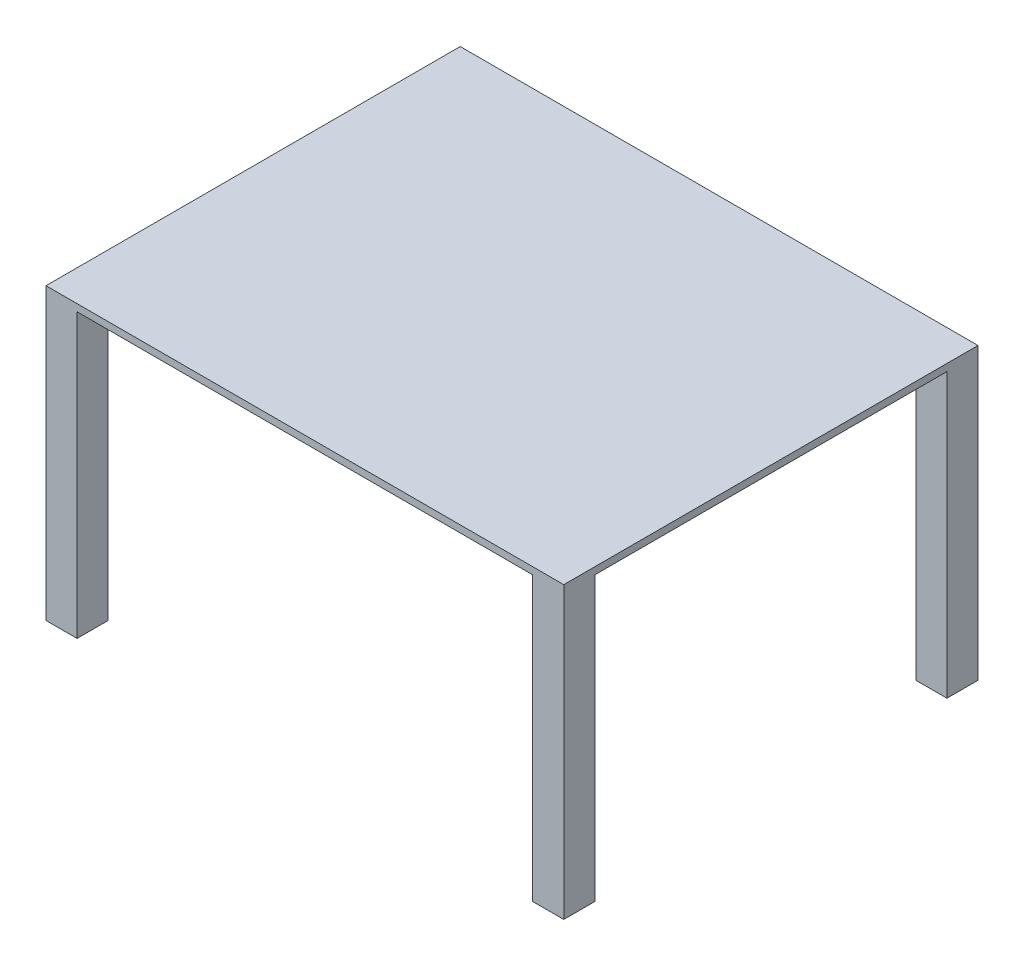
ISO-10303-21;
HEADER;
FILE_DESCRIPTION(('STEP AP214'),'2;1');
FILE_NAME('part.step','',(''),(''),'','','');
FILE_SCHEMA(('AUTOMOTIVE_DESIGN { 1 0 10303 214 1 1 1 1 }'));
ENDSEC;
DATA;
#1=APPLICATION_CONTEXT('core data for automotive mechanical design processes');
#2=APPLICATION_PROTOCOL_DEFINITION('international standard','automotive_design',2000,#1);
#3=PRODUCT_CONTEXT('',#1,'mechanical');
#4=PRODUCT('Part','Part','',(#3));
#5=PRODUCT_RELATED_PRODUCT_CATEGORY('part','',(#4));
#6=PRODUCT_DEFINITION_FORMATION('','',#4);
#7=PRODUCT_DEFINITION_CONTEXT('part definition',#1,'design');
#8=PRODUCT_DEFINITION('design','',#6,#7);
#9=PRODUCT_DEFINITION_SHAPE('','',#8);
#10=(LENGTH_UNIT() NAMED_UNIT(*) SI_UNIT(.MILLI.,.METRE.));
#11=(NAMED_UNIT(*) PLANE_ANGLE_UNIT() SI_UNIT($,.RADIAN.));
#12=(NAMED_UNIT(*) SI_UNIT($,.STERADIAN.) SOLID_ANGLE_UNIT());
#13=UNCERTAINTY_MEASURE_WITH_UNIT(LENGTH_MEASURE(1.E-05),#10,'distance_accuracy_value','');
#14=(GEOMETRIC_REPRESENTATION_CONTEXT(3) GLOBAL_UNCERTAINTY_ASSIGNED_CONTEXT((#13)) GLOBAL_UNIT_ASSIGNED_CONTEXT((#10,
#11,#12)) REPRESENTATION_CONTEXT('',''));
#15=CARTESIAN_POINT('',(0.,0.,0.));
#16=DIRECTION('',(0.,0.,1.));
#17=DIRECTION('',(1.,0.,0.));
#18=AXIS2_PLACEMENT_3D('',#15,#16,#17);
#19=CARTESIAN_POINT('',(-625.,17.,500.));
#20=DIRECTION('',(1.,0.,0.));
#21=DIRECTION('',(0.,0.,-1.));
#22=AXIS2_PLACEMENT_3D('',#19,#20,#21);
#23=PLANE('',#22);
#24=DIRECTION('',(0.,-1.,0.));
#25=VECTOR('',#24,1.);
#26=CARTESIAN_POINT('',(-625.,17.,500.));
#27=LINE('',#26,#25);
#28=CARTESIAN_POINT('',(-625.,17.,500.));
#29=VERTEX_POINT('',#28);
#30=CARTESIAN_POINT('',(-625.,-683.,500.));
#31=VERTEX_POINT('',#30);
#32=EDGE_CURVE('E260',#29,#31,#27,.T.);
#33=ORIENTED_EDGE('',*,*,#32,.F.);
#34=DIRECTION('',(0.,0.,1.));
#35=VECTOR('',#34,1.);
#36=CARTESIAN_POINT('',(-625.,17.,500.));
#37=LINE('',#36,#35);
#38=CARTESIAN_POINT('',(-625.,17.,-500.));
#39=VERTEX_POINT('',#38);
#40=EDGE_CURVE('E243',#39,#29,#37,.T.);
#41=ORIENTED_EDGE('',*,*,#40,.F.);
#42=DIRECTION('',(0.,-1.,0.));
#43=VECTOR('',#42,1.);
#44=CARTESIAN_POINT('',(-625.,17.,-500.));
#45=LINE('',#44,#43);
#46=CARTESIAN_POINT('',(-625.,-683.,-500.));
#47=VERTEX_POINT('',#46);
#48=EDGE_CURVE('E160',#39,#47,#45,.T.);
#49=ORIENTED_EDGE('',*,*,#48,.T.);
#50=DIRECTION('',(0.,0.,1.));
#51=VECTOR('',#50,1.);
#52=CARTESIAN_POINT('',(-625.,-683.,-500.));
#53=LINE('',#52,#51);
#54=CARTESIAN_POINT('',(-625.,-683.,-425.));
#55=VERTEX_POINT('',#54);
#56=EDGE_CURVE('E199',#47,#55,#53,.T.);
#57=ORIENTED_EDGE('',*,*,#56,.T.);
#58=DIRECTION('',(0.,1.,0.));
#59=VECTOR('',#58,1.);
#60=CARTESIAN_POINT('',(-625.,-683.,-425.));
#61=LINE('',#60,#59);
#62=CARTESIAN_POINT('',(-625.,0.,-425.));
#63=VERTEX_POINT('',#62);
#64=EDGE_CURVE('E214',#55,#63,#61,.T.);
#65=ORIENTED_EDGE('',*,*,#64,.T.);
#66=DIRECTION('',(0.,0.,1.));
#67=VECTOR('',#66,1.);
#68=CARTESIAN_POINT('',(-625.,0.,500.));
#69=LINE('',#68,#67);
#70=CARTESIAN_POINT('',(-625.,0.,425.));
#71=VERTEX_POINT('',#70);
#72=EDGE_CURVE('E238',#63,#71,#69,.T.);
#73=ORIENTED_EDGE('',*,*,#72,.T.);
#74=DIRECTION('',(0.,1.,0.));
#75=VECTOR('',#74,1.);
#76=CARTESIAN_POINT('',(-625.,-683.,425.));
#77=LINE('',#76,#75);
#78=CARTESIAN_POINT('',(-625.,-683.,425.));
#79=VERTEX_POINT('',#78);
#80=EDGE_CURVE('E235',#79,#71,#77,.T.);
#81=ORIENTED_EDGE('',*,*,#80,.F.);
#82=DIRECTION('',(0.,0.,1.));
#83=VECTOR('',#82,1.);
#84=CARTESIAN_POINT('',(-625.,-683.,500.));
#85=LINE('',#84,#83);
#86=EDGE_CURVE('E218',#79,#31,#85,.T.);
#87=ORIENTED_EDGE('',*,*,#86,.T.);
#88=EDGE_LOOP('',(#33,#41,#49,#57,#65,#73,#81,#87));
#89=FACE_BOUND('',#88,.T.);
#90=ADVANCED_FACE('F39',(#89),#23,.F.);
#91=CARTESIAN_POINT('',(625.,17.,500.));
#92=DIRECTION('',(0.,0.,-1.));
#93=DIRECTION('',(-1.,0.,0.));
#94=AXIS2_PLACEMENT_3D('',#91,#92,#93);
#95=PLANE('',#94);
#96=DIRECTION('',(1.,0.,0.));
#97=VECTOR('',#96,1.);
#98=CARTESIAN_POINT('',(625.,0.,500.));
#99=LINE('',#98,#97);
#100=CARTESIAN_POINT('',(-550.,0.,500.));
#101=VERTEX_POINT('',#100);
#102=CARTESIAN_POINT('',(550.,0.,500.));
#103=VERTEX_POINT('',#102);
#104=EDGE_CURVE('E252',#101,#103,#99,.T.);
#105=ORIENTED_EDGE('',*,*,#104,.T.);
#106=DIRECTION('',(0.,1.,0.));
#107=VECTOR('',#106,1.);
#108=CARTESIAN_POINT('',(550.,-683.,500.));
#109=LINE('',#108,#107);
#110=CARTESIAN_POINT('',(550.,-683.,500.));
#111=VERTEX_POINT('',#110);
#112=EDGE_CURVE('E197',#111,#103,#109,.T.);
#113=ORIENTED_EDGE('',*,*,#112,.F.);
#114=DIRECTION('',(1.,0.,0.));
#115=VECTOR('',#114,1.);
#116=CARTESIAN_POINT('',(625.,-683.,500.));
#117=LINE('',#116,#115);
#118=CARTESIAN_POINT('',(625.,-683.,500.));
#119=VERTEX_POINT('',#118);
#120=EDGE_CURVE('E193',#111,#119,#117,.T.);
#121=ORIENTED_EDGE('',*,*,#120,.T.);
#122=DIRECTION('',(0.,-1.,0.));
#123=VECTOR('',#122,1.);
#124=CARTESIAN_POINT('',(625.,17.,500.));
#125=LINE('',#124,#123);
#126=CARTESIAN_POINT('',(625.,17.,500.));
#127=VERTEX_POINT('',#126);
#128=EDGE_CURVE('E159',#127,#119,#125,.T.);
#129=ORIENTED_EDGE('',*,*,#128,.F.);
#130=DIRECTION('',(1.,0.,0.));
#131=VECTOR('',#130,1.);
#132=CARTESIAN_POINT('',(625.,17.,500.));
#133=LINE('',#132,#131);
#134=EDGE_CURVE('E245',#29,#127,#133,.T.);
#135=ORIENTED_EDGE('',*,*,#134,.F.);
#136=ORIENTED_EDGE('',*,*,#32,.T.);
#137=DIRECTION('',(1.,0.,0.));
#138=VECTOR('',#137,1.);
#139=CARTESIAN_POINT('',(-625.,-683.,500.));
#140=LINE('',#139,#138);
#141=CARTESIAN_POINT('',(-550.,-683.,500.));
#142=VERTEX_POINT('',#141);
#143=EDGE_CURVE('E225',#31,#142,#140,.T.);
#144=ORIENTED_EDGE('',*,*,#143,.T.);
#145=DIRECTION('',(0.,1.,0.));
#146=VECTOR('',#145,1.);
#147=CARTESIAN_POINT('',(-550.,-683.,500.));
#148=LINE('',#147,#146);
#149=EDGE_CURVE('E234',#142,#101,#148,.T.);
#150=ORIENTED_EDGE('',*,*,#149,.T.);
#151=EDGE_LOOP('',(#105,#113,#121,#129,#135,#136,#144,#150));
#152=FACE_BOUND('',#151,.T.);
#153=ADVANCED_FACE('F301',(#152),#95,.F.);
#154=CARTESIAN_POINT('',(625.,17.,500.));
#155=DIRECTION('',(-1.,0.,0.));
#156=DIRECTION('',(0.,0.,1.));
#157=AXIS2_PLACEMENT_3D('',#154,#155,#156);
#158=PLANE('',#157);
#159=DIRECTION('',(0.,0.,-1.));
#160=VECTOR('',#159,1.);
#161=CARTESIAN_POINT('',(625.,0.,500.));
#162=LINE('',#161,#160);
#163=CARTESIAN_POINT('',(625.,0.,425.));
#164=VERTEX_POINT('',#163);
#165=CARTESIAN_POINT('',(625.,0.,-425.));
#166=VERTEX_POINT('',#165);
#167=EDGE_CURVE('E255',#164,#166,#162,.T.);
#168=ORIENTED_EDGE('',*,*,#167,.T.);
#169=DIRECTION('',(0.,1.,0.));
#170=VECTOR('',#169,1.);
#171=CARTESIAN_POINT('',(625.,-683.,-425.));
#172=LINE('',#171,#170);
#173=CARTESIAN_POINT('',(625.,-683.,-425.));
#174=VERTEX_POINT('',#173);
#175=EDGE_CURVE('E174',#174,#166,#172,.T.);
#176=ORIENTED_EDGE('',*,*,#175,.F.);
#177=DIRECTION('',(0.,0.,-1.));
#178=VECTOR('',#177,1.);
#179=CARTESIAN_POINT('',(625.,-683.,-500.));
#180=LINE('',#179,#178);
#181=CARTESIAN_POINT('',(625.,-683.,-500.));
#182=VERTEX_POINT('',#181);
#183=EDGE_CURVE('E167',#174,#182,#180,.T.);
#184=ORIENTED_EDGE('',*,*,#183,.T.);
#185=DIRECTION('',(0.,-1.,0.));
#186=VECTOR('',#185,1.);
#187=CARTESIAN_POINT('',(625.,17.,-500.));
#188=LINE('',#187,#186);
#189=CARTESIAN_POINT('',(625.,17.,-500.));
#190=VERTEX_POINT('',#189);
#191=EDGE_CURVE('E150',#190,#182,#188,.T.);
#192=ORIENTED_EDGE('',*,*,#191,.F.);
#193=DIRECTION('',(0.,0.,-1.));
#194=VECTOR('',#193,1.);
#195=CARTESIAN_POINT('',(625.,17.,500.));
#196=LINE('',#195,#194);
#197=EDGE_CURVE('E248',#127,#190,#196,.T.);
#198=ORIENTED_EDGE('',*,*,#197,.F.);
#199=ORIENTED_EDGE('',*,*,#128,.T.);
#200=DIRECTION('',(0.,0.,-1.));
#201=VECTOR('',#200,1.);
#202=CARTESIAN_POINT('',(625.,-683.,500.));
#203=LINE('',#202,#201);
#204=CARTESIAN_POINT('',(625.,-683.,425.));
#205=VERTEX_POINT('',#204);
#206=EDGE_CURVE('E181',#119,#205,#203,.T.);
#207=ORIENTED_EDGE('',*,*,#206,.T.);
#208=DIRECTION('',(0.,1.,0.));
#209=VECTOR('',#208,1.);
#210=CARTESIAN_POINT('',(625.,-683.,425.));
#211=LINE('',#210,#209);
#212=EDGE_CURVE('E196',#205,#164,#211,.T.);
#213=ORIENTED_EDGE('',*,*,#212,.T.);
#214=EDGE_LOOP('',(#168,#176,#184,#192,#198,#199,#207,#213));
#215=FACE_BOUND('',#214,.T.);
#216=ADVANCED_FACE('F173',(#215),#158,.F.);
#217=CARTESIAN_POINT('',(625.,17.,-500.));
#218=DIRECTION('',(0.,0.,1.));
#219=DIRECTION('',(1.,0.,0.));
#220=AXIS2_PLACEMENT_3D('',#217,#218,#219);
#221=PLANE('',#220);
#222=ORIENTED_EDGE('',*,*,#48,.F.);
#223=DIRECTION('',(-1.,0.,0.));
#224=VECTOR('',#223,1.);
#225=CARTESIAN_POINT('',(625.,17.,-500.));
#226=LINE('',#225,#224);
#227=EDGE_CURVE('E155',#190,#39,#226,.T.);
#228=ORIENTED_EDGE('',*,*,#227,.F.);
#229=ORIENTED_EDGE('',*,*,#191,.T.);
#230=DIRECTION('',(-1.,0.,0.));
#231=VECTOR('',#230,1.);
#232=CARTESIAN_POINT('',(625.,-683.,-500.));
#233=LINE('',#232,#231);
#234=CARTESIAN_POINT('',(550.,-683.,-500.));
#235=VERTEX_POINT('',#234);
#236=EDGE_CURVE('E154',#182,#235,#233,.T.);
#237=ORIENTED_EDGE('',*,*,#236,.T.);
#238=DIRECTION('',(0.,1.,0.));
#239=VECTOR('',#238,1.);
#240=CARTESIAN_POINT('',(550.,-683.,-500.));
#241=LINE('',#240,#239);
#242=CARTESIAN_POINT('',(550.,0.,-500.));
#243=VERTEX_POINT('',#242);
#244=EDGE_CURVE('E53',#235,#243,#241,.T.);
#245=ORIENTED_EDGE('',*,*,#244,.T.);
#246=DIRECTION('',(-1.,0.,0.));
#247=VECTOR('',#246,1.);
#248=CARTESIAN_POINT('',(625.,0.,-500.));
#249=LINE('',#248,#247);
#250=CARTESIAN_POINT('',(-550.,0.,-500.));
#251=VERTEX_POINT('',#250);
#252=EDGE_CURVE('E246',#243,#251,#249,.T.);
#253=ORIENTED_EDGE('',*,*,#252,.T.);
#254=DIRECTION('',(0.,1.,0.));
#255=VECTOR('',#254,1.);
#256=CARTESIAN_POINT('',(-550.,-683.,-500.));
#257=LINE('',#256,#255);
#258=CARTESIAN_POINT('',(-550.,-683.,-500.));
#259=VERTEX_POINT('',#258);
#260=EDGE_CURVE('E215',#259,#251,#257,.T.);
#261=ORIENTED_EDGE('',*,*,#260,.F.);
#262=DIRECTION('',(-1.,0.,0.));
#263=VECTOR('',#262,1.);
#264=CARTESIAN_POINT('',(-625.,-683.,-500.));
#265=LINE('',#264,#263);
#266=EDGE_CURVE('E211',#259,#47,#265,.T.);
#267=ORIENTED_EDGE('',*,*,#266,.T.);
#268=EDGE_LOOP('',(#222,#228,#229,#237,#245,#253,#261,#267));
#269=FACE_BOUND('',#268,.T.);
#270=ADVANCED_FACE('F153',(#269),#221,.F.);
#271=CARTESIAN_POINT('',(0.,17.,0.));
#272=DIRECTION('',(0.,1.,0.));
#273=DIRECTION('',(0.,0.,1.));
#274=AXIS2_PLACEMENT_3D('',#271,#272,#273);
#275=PLANE('',#274);
#276=ORIENTED_EDGE('',*,*,#197,.T.);
#277=ORIENTED_EDGE('',*,*,#227,.T.);
#278=ORIENTED_EDGE('',*,*,#40,.T.);
#279=ORIENTED_EDGE('',*,*,#134,.T.);
#280=EDGE_LOOP('',(#276,#277,#278,#279));
#281=FACE_BOUND('',#280,.T.);
#282=ADVANCED_FACE('F328',(#281),#275,.T.);
#283=CARTESIAN_POINT('',(0.,0.,0.));
#284=DIRECTION('',(0.,1.,0.));
#285=DIRECTION('',(0.,0.,1.));
#286=AXIS2_PLACEMENT_3D('',#283,#284,#285);
#287=PLANE('',#286);
#288=DIRECTION('',(0.,0.,1.));
#289=VECTOR('',#288,1.);
#290=CARTESIAN_POINT('',(550.,0.,0.));
#291=LINE('',#290,#289);
#292=CARTESIAN_POINT('',(550.,0.,-425.));
#293=VERTEX_POINT('',#292);
#294=EDGE_CURVE('E46',#243,#293,#291,.T.);
#295=ORIENTED_EDGE('',*,*,#294,.T.);
#296=DIRECTION('',(1.,0.,0.));
#297=VECTOR('',#296,1.);
#298=CARTESIAN_POINT('',(0.,0.,-425.));
#299=LINE('',#298,#297);
#300=EDGE_CURVE('E11',#293,#166,#299,.T.);
#301=ORIENTED_EDGE('',*,*,#300,.T.);
#302=ORIENTED_EDGE('',*,*,#167,.F.);
#303=DIRECTION('',(-1.,0.,0.));
#304=VECTOR('',#303,1.);
#305=CARTESIAN_POINT('',(0.,0.,425.));
#306=LINE('',#305,#304);
#307=CARTESIAN_POINT('',(550.,0.,425.));
#308=VERTEX_POINT('',#307);
#309=EDGE_CURVE('E274',#164,#308,#306,.T.);
#310=ORIENTED_EDGE('',*,*,#309,.T.);
#311=DIRECTION('',(0.,0.,1.));
#312=VECTOR('',#311,1.);
#313=CARTESIAN_POINT('',(550.,0.,0.));
#314=LINE('',#313,#312);
#315=EDGE_CURVE('E277',#308,#103,#314,.T.);
#316=ORIENTED_EDGE('',*,*,#315,.T.);
#317=ORIENTED_EDGE('',*,*,#104,.F.);
#318=DIRECTION('',(0.,0.,-1.));
#319=VECTOR('',#318,1.);
#320=CARTESIAN_POINT('',(-550.,0.,0.));
#321=LINE('',#320,#319);
#322=CARTESIAN_POINT('',(-550.,0.,425.));
#323=VERTEX_POINT('',#322);
#324=EDGE_CURVE('E262',#101,#323,#321,.T.);
#325=ORIENTED_EDGE('',*,*,#324,.T.);
#326=DIRECTION('',(-1.,0.,0.));
#327=VECTOR('',#326,1.);
#328=CARTESIAN_POINT('',(0.,0.,425.));
#329=LINE('',#328,#327);
#330=EDGE_CURVE('E265',#323,#71,#329,.T.);
#331=ORIENTED_EDGE('',*,*,#330,.T.);
#332=ORIENTED_EDGE('',*,*,#72,.F.);
#333=DIRECTION('',(1.,0.,0.));
#334=VECTOR('',#333,1.);
#335=CARTESIAN_POINT('',(0.,0.,-425.));
#336=LINE('',#335,#334);
#337=CARTESIAN_POINT('',(-550.,0.,-425.));
#338=VERTEX_POINT('',#337);
#339=EDGE_CURVE('E268',#63,#338,#336,.T.);
#340=ORIENTED_EDGE('',*,*,#339,.T.);
#341=DIRECTION('',(0.,0.,-1.));
#342=VECTOR('',#341,1.);
#343=CARTESIAN_POINT('',(-550.,0.,0.));
#344=LINE('',#343,#342);
#345=EDGE_CURVE('E271',#338,#251,#344,.T.);
#346=ORIENTED_EDGE('',*,*,#345,.T.);
#347=ORIENTED_EDGE('',*,*,#252,.F.);
#348=EDGE_LOOP('',(#295,#301,#302,#310,#316,#317,#325,#331,#332,#340,#346,#347));
#349=FACE_BOUND('',#348,.T.);
#350=ADVANCED_FACE('F282',(#349),#287,.F.);
#351=CARTESIAN_POINT('',(-625.,-683.,425.));
#352=DIRECTION('',(0.,0.,-1.));
#353=DIRECTION('',(-1.,0.,0.));
#354=AXIS2_PLACEMENT_3D('',#351,#352,#353);
#355=PLANE('',#354);
#356=ORIENTED_EDGE('',*,*,#330,.F.);
#357=DIRECTION('',(0.,1.,0.));
#358=VECTOR('',#357,1.);
#359=CARTESIAN_POINT('',(-550.,-683.,425.));
#360=LINE('',#359,#358);
#361=CARTESIAN_POINT('',(-550.,-683.,425.));
#362=VERTEX_POINT('',#361);
#363=EDGE_CURVE('E239',#362,#323,#360,.T.);
#364=ORIENTED_EDGE('',*,*,#363,.F.);
#365=DIRECTION('',(-1.,0.,0.));
#366=VECTOR('',#365,1.);
#367=CARTESIAN_POINT('',(-625.,-683.,425.));
#368=LINE('',#367,#366);
#369=EDGE_CURVE('E231',#362,#79,#368,.T.);
#370=ORIENTED_EDGE('',*,*,#369,.T.);
#371=ORIENTED_EDGE('',*,*,#80,.T.);
#372=EDGE_LOOP('',(#356,#364,#370,#371));
#373=FACE_BOUND('',#372,.T.);
#374=ADVANCED_FACE('F340',(#373),#355,.T.);
#375=CARTESIAN_POINT('',(-550.,-683.,500.));
#376=DIRECTION('',(1.,0.,0.));
#377=DIRECTION('',(0.,0.,-1.));
#378=AXIS2_PLACEMENT_3D('',#375,#376,#377);
#379=PLANE('',#378);
#380=ORIENTED_EDGE('',*,*,#324,.F.);
#381=ORIENTED_EDGE('',*,*,#149,.F.);
#382=DIRECTION('',(0.,0.,-1.));
#383=VECTOR('',#382,1.);
#384=CARTESIAN_POINT('',(-550.,-683.,500.));
#385=LINE('',#384,#383);
#386=EDGE_CURVE('E228',#142,#362,#385,.T.);
#387=ORIENTED_EDGE('',*,*,#386,.T.);
#388=ORIENTED_EDGE('',*,*,#363,.T.);
#389=EDGE_LOOP('',(#380,#381,#387,#388));
#390=FACE_BOUND('',#389,.T.);
#391=ADVANCED_FACE('F319',(#390),#379,.T.);
#392=CARTESIAN_POINT('',(0.,-683.,0.));
#393=DIRECTION('',(0.,-1.,0.));
#394=DIRECTION('',(0.,0.,-1.));
#395=AXIS2_PLACEMENT_3D('',#392,#393,#394);
#396=PLANE('',#395);
#397=ORIENTED_EDGE('',*,*,#86,.F.);
#398=ORIENTED_EDGE('',*,*,#369,.F.);
#399=ORIENTED_EDGE('',*,*,#386,.F.);
#400=ORIENTED_EDGE('',*,*,#143,.F.);
#401=EDGE_LOOP('',(#397,#398,#399,#400));
#402=FACE_BOUND('',#401,.T.);
#403=ADVANCED_FACE('F315',(#402),#396,.T.);
#404=CARTESIAN_POINT('',(-550.,-683.,-500.));
#405=DIRECTION('',(1.,0.,0.));
#406=DIRECTION('',(0.,0.,-1.));
#407=AXIS2_PLACEMENT_3D('',#404,#405,#406);
#408=PLANE('',#407);
#409=ORIENTED_EDGE('',*,*,#345,.F.);
#410=DIRECTION('',(0.,1.,0.));
#411=VECTOR('',#410,1.);
#412=CARTESIAN_POINT('',(-550.,-683.,-425.));
#413=LINE('',#412,#411);
#414=CARTESIAN_POINT('',(-550.,-683.,-425.));
#415=VERTEX_POINT('',#414);
#416=EDGE_CURVE('E219',#415,#338,#413,.T.);
#417=ORIENTED_EDGE('',*,*,#416,.F.);
#418=DIRECTION('',(0.,0.,-1.));
#419=VECTOR('',#418,1.);
#420=CARTESIAN_POINT('',(-550.,-683.,-500.));
#421=LINE('',#420,#419);
#422=EDGE_CURVE('E208',#415,#259,#421,.T.);
#423=ORIENTED_EDGE('',*,*,#422,.T.);
#424=ORIENTED_EDGE('',*,*,#260,.T.);
#425=EDGE_LOOP('',(#409,#417,#423,#424));
#426=FACE_BOUND('',#425,.T.);
#427=ADVANCED_FACE('F414',(#426),#408,.T.);
#428=CARTESIAN_POINT('',(-625.,-683.,-425.));
#429=DIRECTION('',(0.,0.,1.));
#430=DIRECTION('',(1.,0.,0.));
#431=AXIS2_PLACEMENT_3D('',#428,#429,#430);
#432=PLANE('',#431);
#433=ORIENTED_EDGE('',*,*,#339,.F.);
#434=ORIENTED_EDGE('',*,*,#64,.F.);
#435=DIRECTION('',(1.,0.,0.));
#436=VECTOR('',#435,1.);
#437=CARTESIAN_POINT('',(-625.,-683.,-425.));
#438=LINE('',#437,#436);
#439=EDGE_CURVE('E205',#55,#415,#438,.T.);
#440=ORIENTED_EDGE('',*,*,#439,.T.);
#441=ORIENTED_EDGE('',*,*,#416,.T.);
#442=EDGE_LOOP('',(#433,#434,#440,#441));
#443=FACE_BOUND('',#442,.T.);
#444=ADVANCED_FACE('F336',(#443),#432,.T.);
#445=CARTESIAN_POINT('',(0.,-683.,0.));
#446=DIRECTION('',(0.,1.,0.));
#447=DIRECTION('',(0.,0.,1.));
#448=AXIS2_PLACEMENT_3D('',#445,#446,#447);
#449=PLANE('',#448);
#450=ORIENTED_EDGE('',*,*,#56,.F.);
#451=ORIENTED_EDGE('',*,*,#266,.F.);
#452=ORIENTED_EDGE('',*,*,#422,.F.);
#453=ORIENTED_EDGE('',*,*,#439,.F.);
#454=EDGE_LOOP('',(#450,#451,#452,#453));
#455=FACE_BOUND('',#454,.T.);
#456=ADVANCED_FACE('F333',(#455),#449,.F.);
#457=CARTESIAN_POINT('',(550.,-683.,500.));
#458=DIRECTION('',(-1.,0.,0.));
#459=DIRECTION('',(0.,0.,1.));
#460=AXIS2_PLACEMENT_3D('',#457,#458,#459);
#461=PLANE('',#460);
#462=ORIENTED_EDGE('',*,*,#315,.F.);
#463=DIRECTION('',(0.,1.,0.));
#464=VECTOR('',#463,1.);
#465=CARTESIAN_POINT('',(550.,-683.,425.));
#466=LINE('',#465,#464);
#467=CARTESIAN_POINT('',(550.,-683.,425.));
#468=VERTEX_POINT('',#467);
#469=EDGE_CURVE('E61',#468,#308,#466,.T.);
#470=ORIENTED_EDGE('',*,*,#469,.F.);
#471=DIRECTION('',(0.,0.,1.));
#472=VECTOR('',#471,1.);
#473=CARTESIAN_POINT('',(550.,-683.,500.));
#474=LINE('',#473,#472);
#475=EDGE_CURVE('E190',#468,#111,#474,.T.);
#476=ORIENTED_EDGE('',*,*,#475,.T.);
#477=ORIENTED_EDGE('',*,*,#112,.T.);
#478=EDGE_LOOP('',(#462,#470,#476,#477));
#479=FACE_BOUND('',#478,.T.);
#480=ADVANCED_FACE('F322',(#479),#461,.T.);
#481=CARTESIAN_POINT('',(625.,-683.,425.));
#482=DIRECTION('',(0.,0.,-1.));
#483=DIRECTION('',(-1.,0.,0.));
#484=AXIS2_PLACEMENT_3D('',#481,#482,#483);
#485=PLANE('',#484);
#486=ORIENTED_EDGE('',*,*,#309,.F.);
#487=ORIENTED_EDGE('',*,*,#212,.F.);
#488=DIRECTION('',(-1.,0.,0.));
#489=VECTOR('',#488,1.);
#490=CARTESIAN_POINT('',(625.,-683.,425.));
#491=LINE('',#490,#489);
#492=EDGE_CURVE('E188',#205,#468,#491,.T.);
#493=ORIENTED_EDGE('',*,*,#492,.T.);
#494=ORIENTED_EDGE('',*,*,#469,.T.);
#495=EDGE_LOOP('',(#486,#487,#493,#494));
#496=FACE_BOUND('',#495,.T.);
#497=ADVANCED_FACE('F296',(#496),#485,.T.);
#498=CARTESIAN_POINT('',(0.,-683.,0.));
#499=DIRECTION('',(0.,1.,0.));
#500=DIRECTION('',(0.,0.,1.));
#501=AXIS2_PLACEMENT_3D('',#498,#499,#500);
#502=PLANE('',#501);
#503=ORIENTED_EDGE('',*,*,#206,.F.);
#504=ORIENTED_EDGE('',*,*,#120,.F.);
#505=ORIENTED_EDGE('',*,*,#475,.F.);
#506=ORIENTED_EDGE('',*,*,#492,.F.);
#507=EDGE_LOOP('',(#503,#504,#505,#506));
#508=FACE_BOUND('',#507,.T.);
#509=ADVANCED_FACE('F289',(#508),#502,.F.);
#510=CARTESIAN_POINT('',(625.,-683.,-425.));
#511=DIRECTION('',(0.,0.,1.));
#512=DIRECTION('',(1.,0.,0.));
#513=AXIS2_PLACEMENT_3D('',#510,#511,#512);
#514=PLANE('',#513);
#515=ORIENTED_EDGE('',*,*,#300,.F.);
#516=DIRECTION('',(0.,1.,0.));
#517=VECTOR('',#516,1.);
#518=CARTESIAN_POINT('',(550.,-683.,-425.));
#519=LINE('',#518,#517);
#520=CARTESIAN_POINT('',(550.,-683.,-425.));
#521=VERTEX_POINT('',#520);
#522=EDGE_CURVE('E182',#521,#293,#519,.T.);
#523=ORIENTED_EDGE('',*,*,#522,.F.);
#524=DIRECTION('',(1.,0.,0.));
#525=VECTOR('',#524,1.);
#526=CARTESIAN_POINT('',(625.,-683.,-425.));
#527=LINE('',#526,#525);
#528=EDGE_CURVE('E178',#521,#174,#527,.T.);
#529=ORIENTED_EDGE('',*,*,#528,.T.);
#530=ORIENTED_EDGE('',*,*,#175,.T.);
#531=EDGE_LOOP('',(#515,#523,#529,#530));
#532=FACE_BOUND('',#531,.T.);
#533=ADVANCED_FACE('F287',(#532),#514,.T.);
#534=CARTESIAN_POINT('',(550.,-683.,-500.));
#535=DIRECTION('',(-1.,0.,0.));
#536=DIRECTION('',(0.,0.,1.));
#537=AXIS2_PLACEMENT_3D('',#534,#535,#536);
#538=PLANE('',#537);
#539=ORIENTED_EDGE('',*,*,#294,.F.);
#540=ORIENTED_EDGE('',*,*,#244,.F.);
#541=DIRECTION('',(0.,0.,1.));
#542=VECTOR('',#541,1.);
#543=CARTESIAN_POINT('',(550.,-683.,-500.));
#544=LINE('',#543,#542);
#545=EDGE_CURVE('E170',#235,#521,#544,.T.);
#546=ORIENTED_EDGE('',*,*,#545,.T.);
#547=ORIENTED_EDGE('',*,*,#522,.T.);
#548=EDGE_LOOP('',(#539,#540,#546,#547));
#549=FACE_BOUND('',#548,.T.);
#550=ADVANCED_FACE('F285',(#549),#538,.T.);
#551=CARTESIAN_POINT('',(0.,-683.,0.));
#552=DIRECTION('',(0.,-1.,0.));
#553=DIRECTION('',(0.,0.,-1.));
#554=AXIS2_PLACEMENT_3D('',#551,#552,#553);
#555=PLANE('',#554);
#556=ORIENTED_EDGE('',*,*,#183,.F.);
#557=ORIENTED_EDGE('',*,*,#528,.F.);
#558=ORIENTED_EDGE('',*,*,#545,.F.);
#559=ORIENTED_EDGE('',*,*,#236,.F.);
#560=EDGE_LOOP('',(#556,#557,#558,#559));
#561=FACE_BOUND('',#560,.T.);
#562=ADVANCED_FACE('F165',(#561),#555,.T.);
#563=CLOSED_SHELL('',(#90,#153,#216,#270,#282,#350,#374,#391,#403,#427,#444,#456,#480,#497,#509,
#533,#550,#562));
#564=MANIFOLD_SOLID_BREP('B2',#563);
#565=ADVANCED_BREP_SHAPE_REPRESENTATION('',(#18,#564),#14);
#566=SHAPE_DEFINITION_REPRESENTATION(#9,#565);
ENDSEC;
END-ISO-10303-21;
